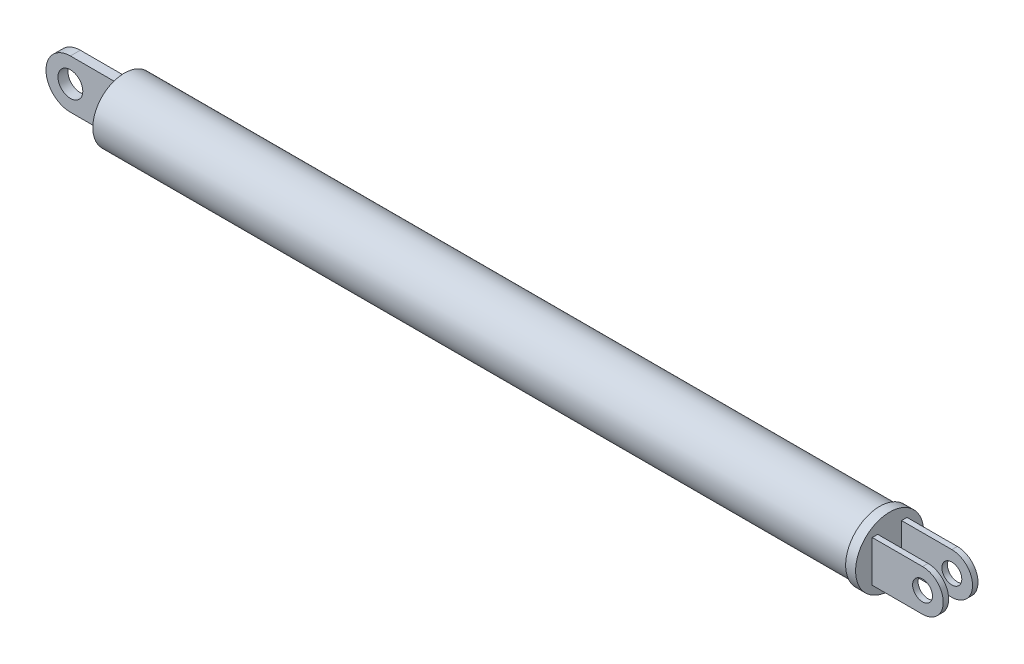
ISO-10303-21;
HEADER;
FILE_DESCRIPTION(('STEP AP214'),'2;1');
FILE_NAME('part.step','',(''),(''),'','','');
FILE_SCHEMA(('AUTOMOTIVE_DESIGN { 1 0 10303 214 1 1 1 1 }'));
ENDSEC;
DATA;
#1=APPLICATION_CONTEXT('core data for automotive mechanical design processes');
#2=APPLICATION_PROTOCOL_DEFINITION('international standard','automotive_design',2000,#1);
#3=PRODUCT_CONTEXT('',#1,'mechanical');
#4=PRODUCT('Part','Part','',(#3));
#5=PRODUCT_RELATED_PRODUCT_CATEGORY('part','',(#4));
#6=PRODUCT_DEFINITION_FORMATION('','',#4);
#7=PRODUCT_DEFINITION_CONTEXT('part definition',#1,'design');
#8=PRODUCT_DEFINITION('design','',#6,#7);
#9=PRODUCT_DEFINITION_SHAPE('','',#8);
#10=(LENGTH_UNIT() NAMED_UNIT(*) SI_UNIT(.MILLI.,.METRE.));
#11=(NAMED_UNIT(*) PLANE_ANGLE_UNIT() SI_UNIT($,.RADIAN.));
#12=(NAMED_UNIT(*) SI_UNIT($,.STERADIAN.) SOLID_ANGLE_UNIT());
#13=UNCERTAINTY_MEASURE_WITH_UNIT(LENGTH_MEASURE(1.E-05),#10,'distance_accuracy_value','');
#14=(GEOMETRIC_REPRESENTATION_CONTEXT(3) GLOBAL_UNCERTAINTY_ASSIGNED_CONTEXT((#13)) GLOBAL_UNIT_ASSIGNED_CONTEXT((#10,
#11,#12)) REPRESENTATION_CONTEXT('',''));
#15=CARTESIAN_POINT('',(0.,0.,0.));
#16=DIRECTION('',(0.,0.,1.));
#17=DIRECTION('',(1.,0.,0.));
#18=AXIS2_PLACEMENT_3D('',#15,#16,#17);
#19=CARTESIAN_POINT('',(308.,-8.32467923574905,7.));
#20=DIRECTION('',(0.,1.,0.));
#21=DIRECTION('',(-1.,0.,0.));
#22=AXIS2_PLACEMENT_3D('',#19,#20,#21);
#23=PLANE('',#22);
#24=DIRECTION('',(0.,0.,-1.));
#25=VECTOR('',#24,1.);
#26=CARTESIAN_POINT('',(328.238920727303,-8.32467923574904,7.));
#27=LINE('',#26,#25);
#28=CARTESIAN_POINT('',(328.238920727303,-8.32467923574904,-4.8012131737594));
#29=VERTEX_POINT('',#28);
#30=CARTESIAN_POINT('',(328.238920727303,-8.32467923574904,-7.));
#31=VERTEX_POINT('',#30);
#32=EDGE_CURVE('E250',#29,#31,#27,.T.);
#33=ORIENTED_EDGE('',*,*,#32,.F.);
#34=DIRECTION('',(-1.,0.,0.));
#35=VECTOR('',#34,1.);
#36=CARTESIAN_POINT('',(308.,-8.32467923574905,-4.8012131737594));
#37=LINE('',#36,#35);
#38=CARTESIAN_POINT('',(308.,-8.32467923574904,-4.8012131737594));
#39=VERTEX_POINT('',#38);
#40=EDGE_CURVE('E219',#29,#39,#37,.T.);
#41=ORIENTED_EDGE('',*,*,#40,.T.);
#42=DIRECTION('',(0.,0.,-1.));
#43=VECTOR('',#42,1.);
#44=CARTESIAN_POINT('',(308.,-8.32467923574905,7.));
#45=LINE('',#44,#43);
#46=CARTESIAN_POINT('',(308.,-8.32467923574905,-7.));
#47=VERTEX_POINT('',#46);
#48=EDGE_CURVE('E152',#39,#47,#45,.T.);
#49=ORIENTED_EDGE('',*,*,#48,.T.);
#50=DIRECTION('',(1.,0.,0.));
#51=VECTOR('',#50,1.);
#52=CARTESIAN_POINT('',(308.,-8.32467923574905,-7.));
#53=LINE('',#52,#51);
#54=EDGE_CURVE('E239',#47,#31,#53,.T.);
#55=ORIENTED_EDGE('',*,*,#54,.T.);
#56=EDGE_LOOP('',(#33,#41,#49,#55));
#57=FACE_BOUND('',#56,.T.);
#58=ADVANCED_FACE('F37',(#57),#23,.F.);
#59=CARTESIAN_POINT('',(328.238920727303,0.,7.));
#60=DIRECTION('',(0.,0.,-1.));
#61=DIRECTION('',(-1.,0.,0.));
#62=AXIS2_PLACEMENT_3D('',#59,#60,#61);
#63=CYLINDRICAL_SURFACE('',#62,8.32467923574905);
#64=DIRECTION('',(0.,0.,-1.));
#65=VECTOR('',#64,1.);
#66=CARTESIAN_POINT('',(328.238920727303,8.32467923574906,7.));
#67=LINE('',#66,#65);
#68=CARTESIAN_POINT('',(328.238920727303,8.32467923574906,-4.8012131737594));
#69=VERTEX_POINT('',#68);
#70=CARTESIAN_POINT('',(328.238920727303,8.32467923574906,-7.));
#71=VERTEX_POINT('',#70);
#72=EDGE_CURVE('E247',#69,#71,#67,.T.);
#73=ORIENTED_EDGE('',*,*,#72,.F.);
#74=CARTESIAN_POINT('',(328.238920727303,0.,-4.8012131737594));
#75=DIRECTION('',(0.,0.,-1.));
#76=DIRECTION('',(-1.,0.,0.));
#77=AXIS2_PLACEMENT_3D('',#74,#75,#76);
#78=CIRCLE('',#77,8.32467923574905);
#79=EDGE_CURVE('E216',#69,#29,#78,.T.);
#80=ORIENTED_EDGE('',*,*,#79,.T.);
#81=ORIENTED_EDGE('',*,*,#32,.T.);
#82=CARTESIAN_POINT('',(328.238920727303,0.,-7.));
#83=DIRECTION('',(0.,0.,1.));
#84=DIRECTION('',(-1.,0.,0.));
#85=AXIS2_PLACEMENT_3D('',#82,#83,#84);
#86=CIRCLE('',#85,8.32467923574905);
#87=EDGE_CURVE('E242',#31,#71,#86,.T.);
#88=ORIENTED_EDGE('',*,*,#87,.T.);
#89=EDGE_LOOP('',(#73,#80,#81,#88));
#90=FACE_BOUND('',#89,.T.);
#91=ADVANCED_FACE('F260',(#90),#63,.T.);
#92=CARTESIAN_POINT('',(308.,8.32467923574905,7.));
#93=DIRECTION('',(0.,-1.,0.));
#94=DIRECTION('',(1.,0.,0.));
#95=AXIS2_PLACEMENT_3D('',#92,#93,#94);
#96=PLANE('',#95);
#97=DIRECTION('',(0.,0.,-1.));
#98=VECTOR('',#97,1.);
#99=CARTESIAN_POINT('',(308.,8.32467923574905,7.));
#100=LINE('',#99,#98);
#101=CARTESIAN_POINT('',(308.,8.32467923574906,-4.8012131737594));
#102=VERTEX_POINT('',#101);
#103=CARTESIAN_POINT('',(308.,8.32467923574905,-7.));
#104=VERTEX_POINT('',#103);
#105=EDGE_CURVE('E62',#102,#104,#100,.T.);
#106=ORIENTED_EDGE('',*,*,#105,.F.);
#107=DIRECTION('',(1.,0.,0.));
#108=VECTOR('',#107,1.);
#109=CARTESIAN_POINT('',(308.,8.32467923574905,-4.8012131737594));
#110=LINE('',#109,#108);
#111=EDGE_CURVE('E213',#102,#69,#110,.T.);
#112=ORIENTED_EDGE('',*,*,#111,.T.);
#113=ORIENTED_EDGE('',*,*,#72,.T.);
#114=DIRECTION('',(-1.,0.,0.));
#115=VECTOR('',#114,1.);
#116=CARTESIAN_POINT('',(308.,8.32467923574905,-7.));
#117=LINE('',#116,#115);
#118=EDGE_CURVE('E232',#71,#104,#117,.T.);
#119=ORIENTED_EDGE('',*,*,#118,.T.);
#120=EDGE_LOOP('',(#106,#112,#113,#119));
#121=FACE_BOUND('',#120,.T.);
#122=ADVANCED_FACE('F256',(#121),#96,.F.);
#123=CARTESIAN_POINT('',(328.238920727303,0.,7.));
#124=DIRECTION('',(0.,0.,-1.));
#125=DIRECTION('',(-1.,0.,0.));
#126=AXIS2_PLACEMENT_3D('',#123,#124,#125);
#127=CYLINDRICAL_SURFACE('',#126,3.99999999999999);
#128=CARTESIAN_POINT('',(328.238920727303,0.,-4.8012131737594));
#129=DIRECTION('',(0.,0.,-1.));
#130=DIRECTION('',(-1.,0.,0.));
#131=AXIS2_PLACEMENT_3D('',#128,#129,#130);
#132=CIRCLE('',#131,3.99999999999999);
#133=CARTESIAN_POINT('',(324.238920727303,0.,-4.8012131737594));
#134=VERTEX_POINT('',#133);
#135=EDGE_CURVE('E41',#134,#134,#132,.T.);
#136=ORIENTED_EDGE('',*,*,#135,.F.);
#137=EDGE_LOOP('',(#136));
#138=FACE_BOUND('',#137,.T.);
#139=CARTESIAN_POINT('',(328.238920727303,0.,-7.));
#140=DIRECTION('',(0.,0.,1.));
#141=DIRECTION('',(1.,0.,0.));
#142=AXIS2_PLACEMENT_3D('',#139,#140,#141);
#143=CIRCLE('',#142,3.99999999999999);
#144=CARTESIAN_POINT('',(332.238920727303,0.,-7.));
#145=VERTEX_POINT('',#144);
#146=EDGE_CURVE('E222',#145,#145,#143,.T.);
#147=ORIENTED_EDGE('',*,*,#146,.F.);
#148=EDGE_LOOP('',(#147));
#149=FACE_BOUND('',#148,.T.);
#150=ADVANCED_FACE('F281',(#138,#149),#127,.F.);
#151=CARTESIAN_POINT('',(308.,0.,0.));
#152=DIRECTION('',(1.,0.,0.));
#153=DIRECTION('',(0.,0.,-1.));
#154=AXIS2_PLACEMENT_3D('',#151,#152,#153);
#155=PLANE('',#154);
#156=ORIENTED_EDGE('',*,*,#48,.F.);
#157=DIRECTION('',(0.,1.,0.));
#158=VECTOR('',#157,1.);
#159=CARTESIAN_POINT('',(308.,-13.7,-4.8012131737594));
#160=LINE('',#159,#158);
#161=EDGE_CURVE('E146',#39,#102,#160,.T.);
#162=ORIENTED_EDGE('',*,*,#161,.T.);
#163=ORIENTED_EDGE('',*,*,#105,.T.);
#164=DIRECTION('',(0.,-1.,0.));
#165=VECTOR('',#164,1.);
#166=CARTESIAN_POINT('',(308.,8.32467923574905,-7.));
#167=LINE('',#166,#165);
#168=EDGE_CURVE('E227',#104,#47,#167,.T.);
#169=ORIENTED_EDGE('',*,*,#168,.T.);
#170=EDGE_LOOP('',(#156,#162,#163,#169));
#171=FACE_BOUND('',#170,.T.);
#172=CARTESIAN_POINT('',(308.,8.32467923574905,7.));
#173=VERTEX_POINT('',#172);
#174=CARTESIAN_POINT('',(308.,8.32467923574905,4.80121317375941));
#175=VERTEX_POINT('',#174);
#176=EDGE_CURVE('E145',#173,#175,#100,.T.);
#177=ORIENTED_EDGE('',*,*,#176,.T.);
#178=DIRECTION('',(0.,1.,0.));
#179=VECTOR('',#178,1.);
#180=CARTESIAN_POINT('',(308.,-13.7,4.80121317375941));
#181=LINE('',#180,#179);
#182=CARTESIAN_POINT('',(308.,-8.32467923574904,4.80121317375941));
#183=VERTEX_POINT('',#182);
#184=EDGE_CURVE('E54',#183,#175,#181,.T.);
#185=ORIENTED_EDGE('',*,*,#184,.F.);
#186=CARTESIAN_POINT('',(308.,-8.32467923574905,7.));
#187=VERTEX_POINT('',#186);
#188=EDGE_CURVE('E143',#187,#183,#45,.T.);
#189=ORIENTED_EDGE('',*,*,#188,.F.);
#190=DIRECTION('',(0.,-1.,0.));
#191=VECTOR('',#190,1.);
#192=CARTESIAN_POINT('',(308.,8.32467923574905,7.));
#193=LINE('',#192,#191);
#194=EDGE_CURVE('E230',#173,#187,#193,.T.);
#195=ORIENTED_EDGE('',*,*,#194,.F.);
#196=EDGE_LOOP('',(#177,#185,#189,#195));
#197=FACE_BOUND('',#196,.T.);
#198=CARTESIAN_POINT('',(308.,0.,0.));
#199=DIRECTION('',(1.,0.,0.));
#200=DIRECTION('',(0.,0.,-1.));
#201=AXIS2_PLACEMENT_3D('',#198,#199,#200);
#202=CIRCLE('',#201,13.7);
#203=CARTESIAN_POINT('',(308.,0.,-13.7));
#204=VERTEX_POINT('',#203);
#205=EDGE_CURVE('E155',#204,#204,#202,.T.);
#206=ORIENTED_EDGE('',*,*,#205,.T.);
#207=EDGE_LOOP('',(#206));
#208=FACE_BOUND('',#207,.T.);
#209=ADVANCED_FACE('F140',(#171,#197,#208),#155,.T.);
#210=CARTESIAN_POINT('',(0.,0.,0.));
#211=DIRECTION('',(1.,0.,0.));
#212=DIRECTION('',(0.,0.,-1.));
#213=AXIS2_PLACEMENT_3D('',#210,#211,#212);
#214=PLANE('',#213);
#215=CARTESIAN_POINT('',(0.,0.,0.));
#216=DIRECTION('',(1.,0.,0.));
#217=DIRECTION('',(0.,0.,-1.));
#218=AXIS2_PLACEMENT_3D('',#215,#216,#217);
#219=CIRCLE('',#218,12.7);
#220=CARTESIAN_POINT('',(0.,0.,-12.7));
#221=VERTEX_POINT('',#220);
#222=EDGE_CURVE('E46',#221,#221,#219,.T.);
#223=ORIENTED_EDGE('',*,*,#222,.F.);
#224=EDGE_LOOP('',(#223));
#225=FACE_BOUND('',#224,.T.);
#226=DIRECTION('',(0.,0.,-1.));
#227=VECTOR('',#226,1.);
#228=CARTESIAN_POINT('',(0.,9.80568754770044,2.));
#229=LINE('',#228,#227);
#230=CARTESIAN_POINT('',(0.,9.80568754770044,2.));
#231=VERTEX_POINT('',#230);
#232=CARTESIAN_POINT('',(0.,9.80568754770044,-2.));
#233=VERTEX_POINT('',#232);
#234=EDGE_CURVE('E198',#231,#233,#229,.T.);
#235=ORIENTED_EDGE('',*,*,#234,.F.);
#236=DIRECTION('',(0.,1.,0.));
#237=VECTOR('',#236,1.);
#238=CARTESIAN_POINT('',(0.,9.80568754770044,2.));
#239=LINE('',#238,#237);
#240=CARTESIAN_POINT('',(0.,-9.80568754770044,2.));
#241=VERTEX_POINT('',#240);
#242=EDGE_CURVE('E171',#241,#231,#239,.T.);
#243=ORIENTED_EDGE('',*,*,#242,.F.);
#244=DIRECTION('',(0.,0.,-1.));
#245=VECTOR('',#244,1.);
#246=CARTESIAN_POINT('',(0.,-9.80568754770044,2.));
#247=LINE('',#246,#245);
#248=CARTESIAN_POINT('',(0.,-9.80568754770044,-2.));
#249=VERTEX_POINT('',#248);
#250=EDGE_CURVE('E183',#241,#249,#247,.T.);
#251=ORIENTED_EDGE('',*,*,#250,.T.);
#252=DIRECTION('',(0.,1.,0.));
#253=VECTOR('',#252,1.);
#254=CARTESIAN_POINT('',(0.,9.80568754770044,-2.));
#255=LINE('',#254,#253);
#256=EDGE_CURVE('E168',#249,#233,#255,.T.);
#257=ORIENTED_EDGE('',*,*,#256,.T.);
#258=EDGE_LOOP('',(#235,#243,#251,#257));
#259=FACE_BOUND('',#258,.T.);
#260=ADVANCED_FACE('F317',(#225,#259),#214,.F.);
#261=CARTESIAN_POINT('',(304.,0.,0.));
#262=DIRECTION('',(-1.,0.,0.));
#263=DIRECTION('',(0.,0.,1.));
#264=AXIS2_PLACEMENT_3D('',#261,#262,#263);
#265=CYLINDRICAL_SURFACE('',#264,12.7);
#266=CARTESIAN_POINT('',(304.,0.,0.));
#267=DIRECTION('',(1.,0.,0.));
#268=DIRECTION('',(0.,0.,-1.));
#269=AXIS2_PLACEMENT_3D('',#266,#267,#268);
#270=CIRCLE('',#269,12.7);
#271=CARTESIAN_POINT('',(304.,0.,-12.7));
#272=VERTEX_POINT('',#271);
#273=EDGE_CURVE('E11',#272,#272,#270,.T.);
#274=ORIENTED_EDGE('',*,*,#273,.F.);
#275=EDGE_LOOP('',(#274));
#276=FACE_BOUND('',#275,.T.);
#277=ORIENTED_EDGE('',*,*,#222,.T.);
#278=EDGE_LOOP('',(#277));
#279=FACE_BOUND('',#278,.T.);
#280=ADVANCED_FACE('F39',(#276,#279),#265,.T.);
#281=CARTESIAN_POINT('',(-19.7330944718316,0.,2.));
#282=DIRECTION('',(0.,0.,1.));
#283=DIRECTION('',(1.,0.,0.));
#284=AXIS2_PLACEMENT_3D('',#281,#282,#283);
#285=PLANE('',#284);
#286=ORIENTED_EDGE('',*,*,#242,.T.);
#287=DIRECTION('',(-1.,0.,0.));
#288=VECTOR('',#287,1.);
#289=CARTESIAN_POINT('',(0.,9.80568754770044,2.));
#290=LINE('',#289,#288);
#291=CARTESIAN_POINT('',(-19.7330944718316,9.80568754770044,2.));
#292=VERTEX_POINT('',#291);
#293=EDGE_CURVE('E175',#231,#292,#290,.T.);
#294=ORIENTED_EDGE('',*,*,#293,.T.);
#295=CARTESIAN_POINT('',(-19.7330944718316,0.,2.));
#296=DIRECTION('',(0.,0.,1.));
#297=DIRECTION('',(1.,0.,0.));
#298=AXIS2_PLACEMENT_3D('',#295,#296,#297);
#299=CIRCLE('',#298,9.80568754770044);
#300=CARTESIAN_POINT('',(-19.7330944718316,-9.80568754770044,2.));
#301=VERTEX_POINT('',#300);
#302=EDGE_CURVE('E178',#292,#301,#299,.T.);
#303=ORIENTED_EDGE('',*,*,#302,.T.);
#304=DIRECTION('',(1.,0.,0.));
#305=VECTOR('',#304,1.);
#306=CARTESIAN_POINT('',(0.,-9.80568754770044,2.));
#307=LINE('',#306,#305);
#308=EDGE_CURVE('E180',#301,#241,#307,.T.);
#309=ORIENTED_EDGE('',*,*,#308,.T.);
#310=EDGE_LOOP('',(#286,#294,#303,#309));
#311=FACE_BOUND('',#310,.T.);
#312=CARTESIAN_POINT('',(-19.7330944718316,0.,2.));
#313=DIRECTION('',(0.,0.,1.));
#314=DIRECTION('',(1.,0.,0.));
#315=AXIS2_PLACEMENT_3D('',#312,#313,#314);
#316=CIRCLE('',#315,5.);
#317=CARTESIAN_POINT('',(-14.7330944718316,0.,2.));
#318=VERTEX_POINT('',#317);
#319=EDGE_CURVE('E165',#318,#318,#316,.T.);
#320=ORIENTED_EDGE('',*,*,#319,.F.);
#321=EDGE_LOOP('',(#320));
#322=FACE_BOUND('',#321,.T.);
#323=ADVANCED_FACE('F338',(#311,#322),#285,.T.);
#324=CARTESIAN_POINT('',(-19.7330944718316,0.,-2.));
#325=DIRECTION('',(0.,0.,1.));
#326=DIRECTION('',(1.,0.,0.));
#327=AXIS2_PLACEMENT_3D('',#324,#325,#326);
#328=PLANE('',#327);
#329=ORIENTED_EDGE('',*,*,#256,.F.);
#330=DIRECTION('',(1.,0.,0.));
#331=VECTOR('',#330,1.);
#332=CARTESIAN_POINT('',(0.,-9.80568754770044,-2.));
#333=LINE('',#332,#331);
#334=CARTESIAN_POINT('',(-19.7330944718316,-9.80568754770044,-2.));
#335=VERTEX_POINT('',#334);
#336=EDGE_CURVE('E176',#335,#249,#333,.T.);
#337=ORIENTED_EDGE('',*,*,#336,.F.);
#338=CARTESIAN_POINT('',(-19.7330944718316,0.,-2.));
#339=DIRECTION('',(0.,0.,1.));
#340=DIRECTION('',(1.,0.,0.));
#341=AXIS2_PLACEMENT_3D('',#338,#339,#340);
#342=CIRCLE('',#341,9.80568754770044);
#343=CARTESIAN_POINT('',(-19.7330944718316,9.80568754770044,-2.));
#344=VERTEX_POINT('',#343);
#345=EDGE_CURVE('E187',#344,#335,#342,.T.);
#346=ORIENTED_EDGE('',*,*,#345,.F.);
#347=DIRECTION('',(-1.,0.,0.));
#348=VECTOR('',#347,1.);
#349=CARTESIAN_POINT('',(0.,9.80568754770044,-2.));
#350=LINE('',#349,#348);
#351=EDGE_CURVE('E185',#233,#344,#350,.T.);
#352=ORIENTED_EDGE('',*,*,#351,.F.);
#353=EDGE_LOOP('',(#329,#337,#346,#352));
#354=FACE_BOUND('',#353,.T.);
#355=CARTESIAN_POINT('',(-19.7330944718316,0.,-2.));
#356=DIRECTION('',(0.,0.,1.));
#357=DIRECTION('',(1.,0.,0.));
#358=AXIS2_PLACEMENT_3D('',#355,#356,#357);
#359=CIRCLE('',#358,5.);
#360=CARTESIAN_POINT('',(-14.7330944718316,0.,-2.));
#361=VERTEX_POINT('',#360);
#362=EDGE_CURVE('E163',#361,#361,#359,.T.);
#363=ORIENTED_EDGE('',*,*,#362,.T.);
#364=EDGE_LOOP('',(#363));
#365=FACE_BOUND('',#364,.T.);
#366=ADVANCED_FACE('F341',(#354,#365),#328,.F.);
#367=CARTESIAN_POINT('',(0.,9.80568754770044,2.));
#368=DIRECTION('',(0.,-1.,0.));
#369=DIRECTION('',(1.,0.,0.));
#370=AXIS2_PLACEMENT_3D('',#367,#368,#369);
#371=PLANE('',#370);
#372=ORIENTED_EDGE('',*,*,#351,.T.);
#373=DIRECTION('',(0.,0.,-1.));
#374=VECTOR('',#373,1.);
#375=CARTESIAN_POINT('',(-19.7330944718316,9.80568754770044,2.));
#376=LINE('',#375,#374);
#377=EDGE_CURVE('E195',#292,#344,#376,.T.);
#378=ORIENTED_EDGE('',*,*,#377,.F.);
#379=ORIENTED_EDGE('',*,*,#293,.F.);
#380=ORIENTED_EDGE('',*,*,#234,.T.);
#381=EDGE_LOOP('',(#372,#378,#379,#380));
#382=FACE_BOUND('',#381,.T.);
#383=ADVANCED_FACE('F345',(#382),#371,.F.);
#384=CARTESIAN_POINT('',(-19.7330944718316,0.,2.));
#385=DIRECTION('',(0.,0.,-1.));
#386=DIRECTION('',(-1.,0.,0.));
#387=AXIS2_PLACEMENT_3D('',#384,#385,#386);
#388=CYLINDRICAL_SURFACE('',#387,9.80568754770044);
#389=ORIENTED_EDGE('',*,*,#345,.T.);
#390=DIRECTION('',(0.,0.,-1.));
#391=VECTOR('',#390,1.);
#392=CARTESIAN_POINT('',(-19.7330944718316,-9.80568754770044,2.));
#393=LINE('',#392,#391);
#394=EDGE_CURVE('E192',#301,#335,#393,.T.);
#395=ORIENTED_EDGE('',*,*,#394,.F.);
#396=ORIENTED_EDGE('',*,*,#302,.F.);
#397=ORIENTED_EDGE('',*,*,#377,.T.);
#398=EDGE_LOOP('',(#389,#395,#396,#397));
#399=FACE_BOUND('',#398,.T.);
#400=ADVANCED_FACE('F349',(#399),#388,.T.);
#401=CARTESIAN_POINT('',(0.,-9.80568754770044,2.));
#402=DIRECTION('',(0.,1.,0.));
#403=DIRECTION('',(-1.,0.,0.));
#404=AXIS2_PLACEMENT_3D('',#401,#402,#403);
#405=PLANE('',#404);
#406=ORIENTED_EDGE('',*,*,#336,.T.);
#407=ORIENTED_EDGE('',*,*,#250,.F.);
#408=ORIENTED_EDGE('',*,*,#308,.F.);
#409=ORIENTED_EDGE('',*,*,#394,.T.);
#410=EDGE_LOOP('',(#406,#407,#408,#409));
#411=FACE_BOUND('',#410,.T.);
#412=ADVANCED_FACE('F336',(#411),#405,.F.);
#413=CARTESIAN_POINT('',(-19.7330944718316,0.,2.));
#414=DIRECTION('',(0.,0.,-1.));
#415=DIRECTION('',(-1.,0.,0.));
#416=AXIS2_PLACEMENT_3D('',#413,#414,#415);
#417=CYLINDRICAL_SURFACE('',#416,5.);
#418=ORIENTED_EDGE('',*,*,#319,.T.);
#419=EDGE_LOOP('',(#418));
#420=FACE_BOUND('',#419,.T.);
#421=ORIENTED_EDGE('',*,*,#362,.F.);
#422=EDGE_LOOP('',(#421));
#423=FACE_BOUND('',#422,.T.);
#424=ADVANCED_FACE('F329',(#420,#423),#417,.F.);
#425=CARTESIAN_POINT('',(304.,0.,0.));
#426=DIRECTION('',(1.,0.,0.));
#427=DIRECTION('',(0.,0.,-1.));
#428=AXIS2_PLACEMENT_3D('',#425,#426,#427);
#429=PLANE('',#428);
#430=CARTESIAN_POINT('',(304.,0.,0.));
#431=DIRECTION('',(1.,0.,0.));
#432=DIRECTION('',(0.,0.,-1.));
#433=AXIS2_PLACEMENT_3D('',#430,#431,#432);
#434=CIRCLE('',#433,13.7);
#435=CARTESIAN_POINT('',(304.,0.,-13.7));
#436=VERTEX_POINT('',#435);
#437=EDGE_CURVE('E151',#436,#436,#434,.T.);
#438=ORIENTED_EDGE('',*,*,#437,.F.);
#439=EDGE_LOOP('',(#438));
#440=FACE_BOUND('',#439,.T.);
#441=ORIENTED_EDGE('',*,*,#273,.T.);
#442=EDGE_LOOP('',(#441));
#443=FACE_BOUND('',#442,.T.);
#444=ADVANCED_FACE('F326',(#440,#443),#429,.F.);
#445=CARTESIAN_POINT('',(308.,0.,0.));
#446=DIRECTION('',(-1.,0.,0.));
#447=DIRECTION('',(0.,0.,1.));
#448=AXIS2_PLACEMENT_3D('',#445,#446,#447);
#449=CYLINDRICAL_SURFACE('',#448,13.7);
#450=ORIENTED_EDGE('',*,*,#205,.F.);
#451=EDGE_LOOP('',(#450));
#452=FACE_BOUND('',#451,.T.);
#453=ORIENTED_EDGE('',*,*,#437,.T.);
#454=EDGE_LOOP('',(#453));
#455=FACE_BOUND('',#454,.T.);
#456=ADVANCED_FACE('F302',(#452,#455),#449,.T.);
#457=CARTESIAN_POINT('',(328.238920727303,0.,7.));
#458=DIRECTION('',(0.,0.,-1.));
#459=DIRECTION('',(-1.,0.,0.));
#460=AXIS2_PLACEMENT_3D('',#457,#458,#459);
#461=PLANE('',#460);
#462=ORIENTED_EDGE('',*,*,#194,.T.);
#463=DIRECTION('',(1.,0.,0.));
#464=VECTOR('',#463,1.);
#465=CARTESIAN_POINT('',(308.,-8.32467923574905,7.));
#466=LINE('',#465,#464);
#467=CARTESIAN_POINT('',(328.238920727303,-8.32467923574904,7.));
#468=VERTEX_POINT('',#467);
#469=EDGE_CURVE('E149',#187,#468,#466,.T.);
#470=ORIENTED_EDGE('',*,*,#469,.T.);
#471=CARTESIAN_POINT('',(328.238920727303,0.,7.));
#472=DIRECTION('',(0.,0.,1.));
#473=DIRECTION('',(-1.,0.,0.));
#474=AXIS2_PLACEMENT_3D('',#471,#472,#473);
#475=CIRCLE('',#474,8.32467923574905);
#476=CARTESIAN_POINT('',(328.238920727303,8.32467923574906,7.));
#477=VERTEX_POINT('',#476);
#478=EDGE_CURVE('E234',#468,#477,#475,.T.);
#479=ORIENTED_EDGE('',*,*,#478,.T.);
#480=DIRECTION('',(-1.,0.,0.));
#481=VECTOR('',#480,1.);
#482=CARTESIAN_POINT('',(308.,8.32467923574905,7.));
#483=LINE('',#482,#481);
#484=EDGE_CURVE('E236',#477,#173,#483,.T.);
#485=ORIENTED_EDGE('',*,*,#484,.T.);
#486=EDGE_LOOP('',(#462,#470,#479,#485));
#487=FACE_BOUND('',#486,.T.);
#488=CARTESIAN_POINT('',(328.238920727303,0.,7.));
#489=DIRECTION('',(0.,0.,1.));
#490=DIRECTION('',(1.,0.,0.));
#491=AXIS2_PLACEMENT_3D('',#488,#489,#490);
#492=CIRCLE('',#491,3.99999999999999);
#493=CARTESIAN_POINT('',(332.238920727303,0.,7.));
#494=VERTEX_POINT('',#493);
#495=EDGE_CURVE('E223',#494,#494,#492,.T.);
#496=ORIENTED_EDGE('',*,*,#495,.F.);
#497=EDGE_LOOP('',(#496));
#498=FACE_BOUND('',#497,.T.);
#499=ADVANCED_FACE('F297',(#487,#498),#461,.F.);
#500=CARTESIAN_POINT('',(328.238920727303,0.,-7.));
#501=DIRECTION('',(0.,0.,-1.));
#502=DIRECTION('',(-1.,0.,0.));
#503=AXIS2_PLACEMENT_3D('',#500,#501,#502);
#504=PLANE('',#503);
#505=ORIENTED_EDGE('',*,*,#168,.F.);
#506=ORIENTED_EDGE('',*,*,#118,.F.);
#507=ORIENTED_EDGE('',*,*,#87,.F.);
#508=ORIENTED_EDGE('',*,*,#54,.F.);
#509=EDGE_LOOP('',(#505,#506,#507,#508));
#510=FACE_BOUND('',#509,.T.);
#511=ORIENTED_EDGE('',*,*,#146,.T.);
#512=EDGE_LOOP('',(#511));
#513=FACE_BOUND('',#512,.T.);
#514=ADVANCED_FACE('F264',(#510,#513),#504,.T.);
#515=ORIENTED_EDGE('',*,*,#188,.T.);
#516=DIRECTION('',(1.,0.,0.));
#517=VECTOR('',#516,1.);
#518=CARTESIAN_POINT('',(308.,-8.32467923574905,4.80121317375941));
#519=LINE('',#518,#517);
#520=CARTESIAN_POINT('',(328.238920727303,-8.32467923574904,4.80121317375941));
#521=VERTEX_POINT('',#520);
#522=EDGE_CURVE('E128',#183,#521,#519,.T.);
#523=ORIENTED_EDGE('',*,*,#522,.T.);
#524=EDGE_CURVE('E157',#468,#521,#27,.T.);
#525=ORIENTED_EDGE('',*,*,#524,.F.);
#526=ORIENTED_EDGE('',*,*,#469,.F.);
#527=EDGE_LOOP('',(#515,#523,#525,#526));
#528=FACE_BOUND('',#527,.T.);
#529=ADVANCED_FACE('F148',(#528),#23,.F.);
#530=ORIENTED_EDGE('',*,*,#524,.T.);
#531=CARTESIAN_POINT('',(328.238920727303,0.,4.80121317375941));
#532=DIRECTION('',(0.,0.,1.));
#533=DIRECTION('',(1.,0.,0.));
#534=AXIS2_PLACEMENT_3D('',#531,#532,#533);
#535=CIRCLE('',#534,8.32467923574905);
#536=CARTESIAN_POINT('',(328.238920727303,8.32467923574906,4.80121317375941));
#537=VERTEX_POINT('',#536);
#538=EDGE_CURVE('E131',#521,#537,#535,.T.);
#539=ORIENTED_EDGE('',*,*,#538,.T.);
#540=EDGE_CURVE('E248',#477,#537,#67,.T.);
#541=ORIENTED_EDGE('',*,*,#540,.F.);
#542=ORIENTED_EDGE('',*,*,#478,.F.);
#543=EDGE_LOOP('',(#530,#539,#541,#542));
#544=FACE_BOUND('',#543,.T.);
#545=ADVANCED_FACE('F289',(#544),#63,.T.);
#546=ORIENTED_EDGE('',*,*,#540,.T.);
#547=DIRECTION('',(-1.,0.,0.));
#548=VECTOR('',#547,1.);
#549=CARTESIAN_POINT('',(308.,8.32467923574905,4.80121317375941));
#550=LINE('',#549,#548);
#551=EDGE_CURVE('E205',#537,#175,#550,.T.);
#552=ORIENTED_EDGE('',*,*,#551,.T.);
#553=ORIENTED_EDGE('',*,*,#176,.F.);
#554=ORIENTED_EDGE('',*,*,#484,.F.);
#555=EDGE_LOOP('',(#546,#552,#553,#554));
#556=FACE_BOUND('',#555,.T.);
#557=ADVANCED_FACE('F278',(#556),#96,.F.);
#558=CARTESIAN_POINT('',(328.238920727303,0.,4.80121317375941));
#559=DIRECTION('',(0.,0.,1.));
#560=DIRECTION('',(1.,0.,0.));
#561=AXIS2_PLACEMENT_3D('',#558,#559,#560);
#562=CIRCLE('',#561,3.99999999999999);
#563=CARTESIAN_POINT('',(332.238920727303,0.,4.80121317375941));
#564=VERTEX_POINT('',#563);
#565=EDGE_CURVE('E203',#564,#564,#562,.T.);
#566=ORIENTED_EDGE('',*,*,#565,.F.);
#567=EDGE_LOOP('',(#566));
#568=FACE_BOUND('',#567,.T.);
#569=ORIENTED_EDGE('',*,*,#495,.T.);
#570=EDGE_LOOP('',(#569));
#571=FACE_BOUND('',#570,.T.);
#572=ADVANCED_FACE('F270',(#568,#571),#127,.F.);
#573=CARTESIAN_POINT('',(308.,-13.7,-4.8012131737594));
#574=DIRECTION('',(0.,0.,-1.));
#575=DIRECTION('',(-1.,0.,0.));
#576=AXIS2_PLACEMENT_3D('',#573,#574,#575);
#577=PLANE('',#576);
#578=ORIENTED_EDGE('',*,*,#135,.T.);
#579=EDGE_LOOP('',(#578));
#580=FACE_BOUND('',#579,.T.);
#581=ORIENTED_EDGE('',*,*,#79,.F.);
#582=ORIENTED_EDGE('',*,*,#111,.F.);
#583=ORIENTED_EDGE('',*,*,#161,.F.);
#584=ORIENTED_EDGE('',*,*,#40,.F.);
#585=EDGE_LOOP('',(#581,#582,#583,#584));
#586=FACE_BOUND('',#585,.T.);
#587=ADVANCED_FACE('F268',(#580,#586),#577,.F.);
#588=CARTESIAN_POINT('',(308.,-13.7,4.80121317375941));
#589=DIRECTION('',(0.,0.,1.));
#590=DIRECTION('',(1.,0.,0.));
#591=AXIS2_PLACEMENT_3D('',#588,#589,#590);
#592=PLANE('',#591);
#593=ORIENTED_EDGE('',*,*,#565,.T.);
#594=EDGE_LOOP('',(#593));
#595=FACE_BOUND('',#594,.T.);
#596=ORIENTED_EDGE('',*,*,#184,.T.);
#597=ORIENTED_EDGE('',*,*,#551,.F.);
#598=ORIENTED_EDGE('',*,*,#538,.F.);
#599=ORIENTED_EDGE('',*,*,#522,.F.);
#600=EDGE_LOOP('',(#596,#597,#598,#599));
#601=FACE_BOUND('',#600,.T.);
#602=ADVANCED_FACE('F129',(#595,#601),#592,.F.);
#603=CLOSED_SHELL('',(#58,#91,#122,#150,#209,#260,#280,#323,#366,#383,#400,#412,#424,#444,#456,
#499,#514,#529,#545,#557,#572,#587,#602));
#604=MANIFOLD_SOLID_BREP('B2',#603);
#605=ADVANCED_BREP_SHAPE_REPRESENTATION('',(#18,#604),#14);
#606=SHAPE_DEFINITION_REPRESENTATION(#9,#605);
ENDSEC;
END-ISO-10303-21;
